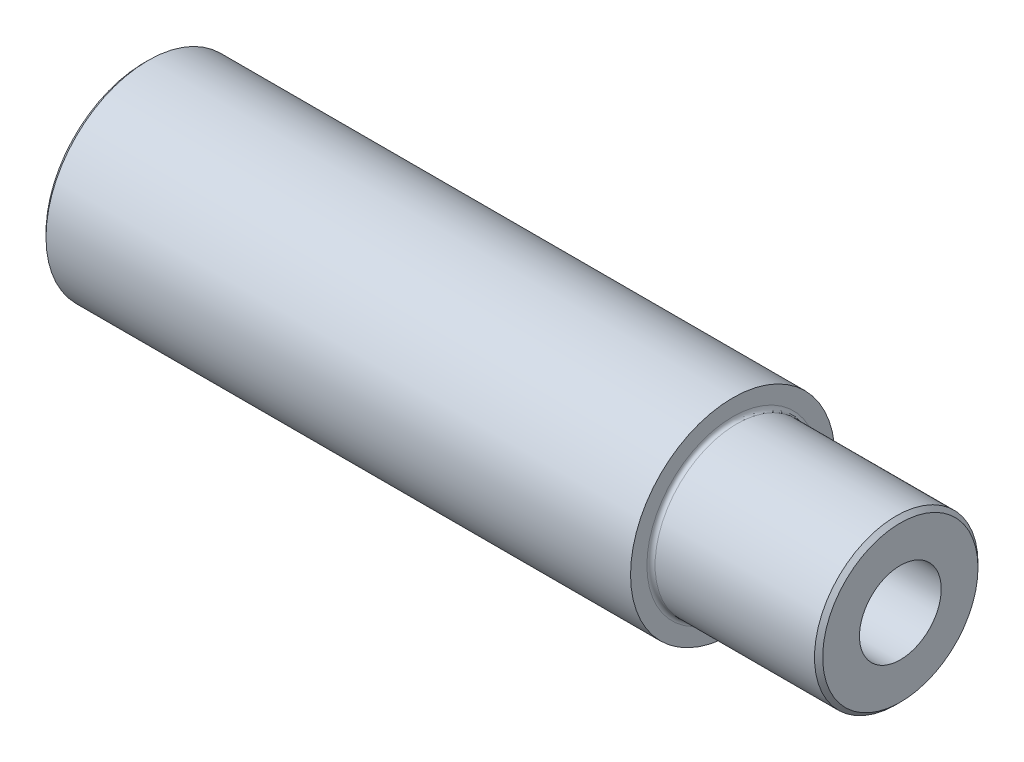
ISO-10303-21;
HEADER;
FILE_DESCRIPTION(('STEP AP214'),'2;1');
FILE_NAME('part.step','',(''),(''),'','','');
FILE_SCHEMA(('AUTOMOTIVE_DESIGN { 1 0 10303 214 1 1 1 1 }'));
ENDSEC;
DATA;
#1=APPLICATION_CONTEXT('core data for automotive mechanical design processes');
#2=APPLICATION_PROTOCOL_DEFINITION('international standard','automotive_design',2000,#1);
#3=PRODUCT_CONTEXT('',#1,'mechanical');
#4=PRODUCT('Part','Part','',(#3));
#5=PRODUCT_RELATED_PRODUCT_CATEGORY('part','',(#4));
#6=PRODUCT_DEFINITION_FORMATION('','',#4);
#7=PRODUCT_DEFINITION_CONTEXT('part definition',#1,'design');
#8=PRODUCT_DEFINITION('design','',#6,#7);
#9=PRODUCT_DEFINITION_SHAPE('','',#8);
#10=(LENGTH_UNIT() NAMED_UNIT(*) SI_UNIT(.MILLI.,.METRE.));
#11=(NAMED_UNIT(*) PLANE_ANGLE_UNIT() SI_UNIT($,.RADIAN.));
#12=(NAMED_UNIT(*) SI_UNIT($,.STERADIAN.) SOLID_ANGLE_UNIT());
#13=UNCERTAINTY_MEASURE_WITH_UNIT(LENGTH_MEASURE(1.E-05),#10,'distance_accuracy_value','');
#14=(GEOMETRIC_REPRESENTATION_CONTEXT(3) GLOBAL_UNCERTAINTY_ASSIGNED_CONTEXT((#13)) GLOBAL_UNIT_ASSIGNED_CONTEXT((#10,
#11,#12)) REPRESENTATION_CONTEXT('',''));
#15=CARTESIAN_POINT('',(0.,0.,0.));
#16=DIRECTION('',(0.,0.,1.));
#17=DIRECTION('',(1.,0.,0.));
#18=AXIS2_PLACEMENT_3D('',#15,#16,#17);
#19=CARTESIAN_POINT('',(92.5,0.,0.));
#20=DIRECTION('',(1.,0.,0.));
#21=DIRECTION('',(0.,0.,-1.));
#22=AXIS2_PLACEMENT_3D('',#19,#20,#21);
#23=PLANE('',#22);
#24=CARTESIAN_POINT('',(92.5,0.,0.));
#25=DIRECTION('',(1.,0.,0.));
#26=DIRECTION('',(0.,0.,-1.));
#27=AXIS2_PLACEMENT_3D('',#24,#25,#26);
#28=CIRCLE('',#27,9.49999999999999);
#29=CARTESIAN_POINT('',(92.5,0.,-9.49999999999999));
#30=VERTEX_POINT('',#29);
#31=EDGE_CURVE('E56',#30,#30,#28,.T.);
#32=ORIENTED_EDGE('',*,*,#31,.T.);
#33=EDGE_LOOP('',(#32));
#34=FACE_BOUND('',#33,.T.);
#35=CARTESIAN_POINT('',(92.5,0.,0.));
#36=DIRECTION('',(1.,0.,0.));
#37=DIRECTION('',(0.,0.,-1.));
#38=AXIS2_PLACEMENT_3D('',#35,#36,#37);
#39=CIRCLE('',#38,5.);
#40=CARTESIAN_POINT('',(92.5,0.,-5.));
#41=VERTEX_POINT('',#40);
#42=EDGE_CURVE('E79',#41,#41,#39,.T.);
#43=ORIENTED_EDGE('',*,*,#42,.F.);
#44=EDGE_LOOP('',(#43));
#45=FACE_BOUND('',#44,.T.);
#46=ADVANCED_FACE('F49',(#34,#45),#23,.T.);
#47=CARTESIAN_POINT('',(92.5,0.,0.));
#48=DIRECTION('',(-1.,0.,0.));
#49=DIRECTION('',(0.,0.,1.));
#50=AXIS2_PLACEMENT_3D('',#47,#48,#49);
#51=CYLINDRICAL_SURFACE('',#50,12.5);
#52=CARTESIAN_POINT('',(0.500000000000014,0.,0.));
#53=DIRECTION('',(1.,0.,0.));
#54=DIRECTION('',(0.,0.,-1.));
#55=AXIS2_PLACEMENT_3D('',#52,#53,#54);
#56=CIRCLE('',#55,12.5);
#57=CARTESIAN_POINT('',(0.500000000000014,0.,-12.5));
#58=VERTEX_POINT('',#57);
#59=EDGE_CURVE('E65',#58,#58,#56,.T.);
#60=ORIENTED_EDGE('',*,*,#59,.T.);
#61=EDGE_LOOP('',(#60));
#62=FACE_BOUND('',#61,.T.);
#63=CARTESIAN_POINT('',(72.,0.,0.));
#64=DIRECTION('',(1.,0.,0.));
#65=DIRECTION('',(0.,0.,-1.));
#66=AXIS2_PLACEMENT_3D('',#63,#64,#65);
#67=CIRCLE('',#66,12.5);
#68=CARTESIAN_POINT('',(72.,0.,-12.5));
#69=VERTEX_POINT('',#68);
#70=EDGE_CURVE('E80',#69,#69,#67,.T.);
#71=ORIENTED_EDGE('',*,*,#70,.F.);
#72=EDGE_LOOP('',(#71));
#73=FACE_BOUND('',#72,.T.);
#74=ADVANCED_FACE('F95',(#62,#73),#51,.T.);
#75=CARTESIAN_POINT('',(0.,0.,0.));
#76=DIRECTION('',(1.,0.,0.));
#77=DIRECTION('',(0.,0.,-1.));
#78=AXIS2_PLACEMENT_3D('',#75,#76,#77);
#79=PLANE('',#78);
#80=CARTESIAN_POINT('',(0.,0.,0.));
#81=DIRECTION('',(1.,0.,0.));
#82=DIRECTION('',(0.,0.,-1.));
#83=AXIS2_PLACEMENT_3D('',#80,#81,#82);
#84=CIRCLE('',#83,12.);
#85=CARTESIAN_POINT('',(0.,0.,-12.));
#86=VERTEX_POINT('',#85);
#87=EDGE_CURVE('E60',#86,#86,#84,.F.);
#88=ORIENTED_EDGE('',*,*,#87,.T.);
#89=EDGE_LOOP('',(#88));
#90=FACE_BOUND('',#89,.T.);
#91=CARTESIAN_POINT('',(0.,0.,0.));
#92=DIRECTION('',(1.,0.,0.));
#93=DIRECTION('',(0.,0.,-1.));
#94=AXIS2_PLACEMENT_3D('',#91,#92,#93);
#95=CIRCLE('',#94,5.);
#96=CARTESIAN_POINT('',(0.,0.,-5.));
#97=VERTEX_POINT('',#96);
#98=EDGE_CURVE('E84',#97,#97,#95,.T.);
#99=ORIENTED_EDGE('',*,*,#98,.T.);
#100=EDGE_LOOP('',(#99));
#101=FACE_BOUND('',#100,.T.);
#102=ADVANCED_FACE('F100',(#90,#101),#79,.F.);
#103=CARTESIAN_POINT('',(92.5,0.,0.));
#104=DIRECTION('',(-1.,0.,0.));
#105=DIRECTION('',(0.,0.,1.));
#106=AXIS2_PLACEMENT_3D('',#103,#104,#105);
#107=CYLINDRICAL_SURFACE('',#106,5.);
#108=ORIENTED_EDGE('',*,*,#42,.T.);
#109=EDGE_LOOP('',(#108));
#110=FACE_BOUND('',#109,.T.);
#111=ORIENTED_EDGE('',*,*,#98,.F.);
#112=EDGE_LOOP('',(#111));
#113=FACE_BOUND('',#112,.T.);
#114=ADVANCED_FACE('F91',(#110,#113),#107,.F.);
#115=CARTESIAN_POINT('',(72.,0.,0.));
#116=DIRECTION('',(1.,0.,0.));
#117=DIRECTION('',(0.,0.,-1.));
#118=AXIS2_PLACEMENT_3D('',#115,#116,#117);
#119=PLANE('',#118);
#120=CARTESIAN_POINT('',(72.,0.,0.));
#121=DIRECTION('',(1.,0.,0.));
#122=DIRECTION('',(0.,0.,-1.));
#123=AXIS2_PLACEMENT_3D('',#120,#121,#122);
#124=CIRCLE('',#123,10.5);
#125=CARTESIAN_POINT('',(72.,0.,-10.5));
#126=VERTEX_POINT('',#125);
#127=EDGE_CURVE('E71',#126,#126,#124,.F.);
#128=ORIENTED_EDGE('',*,*,#127,.T.);
#129=EDGE_LOOP('',(#128));
#130=FACE_BOUND('',#129,.T.);
#131=ORIENTED_EDGE('',*,*,#70,.T.);
#132=EDGE_LOOP('',(#131));
#133=FACE_BOUND('',#132,.T.);
#134=ADVANCED_FACE('F126',(#130,#133),#119,.T.);
#135=CARTESIAN_POINT('',(72.,0.,0.));
#136=DIRECTION('',(1.,0.,0.));
#137=DIRECTION('',(0.,0.,-1.));
#138=AXIS2_PLACEMENT_3D('',#135,#136,#137);
#139=CYLINDRICAL_SURFACE('',#138,10.);
#140=CARTESIAN_POINT('',(92.,0.,0.));
#141=DIRECTION('',(1.,0.,0.));
#142=DIRECTION('',(0.,0.,-1.));
#143=AXIS2_PLACEMENT_3D('',#140,#141,#142);
#144=CIRCLE('',#143,10.);
#145=CARTESIAN_POINT('',(92.,0.,-10.));
#146=VERTEX_POINT('',#145);
#147=EDGE_CURVE('E13',#146,#146,#144,.F.);
#148=ORIENTED_EDGE('',*,*,#147,.T.);
#149=EDGE_LOOP('',(#148));
#150=FACE_BOUND('',#149,.T.);
#151=CARTESIAN_POINT('',(72.5,0.,0.));
#152=DIRECTION('',(1.,0.,0.));
#153=DIRECTION('',(0.,0.,-1.));
#154=AXIS2_PLACEMENT_3D('',#151,#152,#153);
#155=CIRCLE('',#154,10.);
#156=CARTESIAN_POINT('',(72.5,0.,-10.));
#157=VERTEX_POINT('',#156);
#158=EDGE_CURVE('E75',#157,#157,#155,.T.);
#159=ORIENTED_EDGE('',*,*,#158,.T.);
#160=EDGE_LOOP('',(#159));
#161=FACE_BOUND('',#160,.T.);
#162=ADVANCED_FACE('F112',(#150,#161),#139,.T.);
#163=CARTESIAN_POINT('',(72.5,0.,0.));
#164=DIRECTION('',(1.,0.,0.));
#165=DIRECTION('',(0.,0.,-1.));
#166=AXIS2_PLACEMENT_3D('',#163,#164,#165);
#167=TOROIDAL_SURFACE('',#166,10.5,0.5);
#168=ORIENTED_EDGE('',*,*,#127,.F.);
#169=EDGE_LOOP('',(#168));
#170=FACE_BOUND('',#169,.T.);
#171=ORIENTED_EDGE('',*,*,#158,.F.);
#172=EDGE_LOOP('',(#171));
#173=FACE_BOUND('',#172,.T.);
#174=ADVANCED_FACE('F109',(#170,#173),#167,.F.);
#175=CARTESIAN_POINT('',(0.500000000000014,0.,0.));
#176=DIRECTION('',(1.,0.,0.));
#177=DIRECTION('',(0.,0.,-1.));
#178=AXIS2_PLACEMENT_3D('',#175,#176,#177);
#179=CONICAL_SURFACE('',#178,12.5,0.785398163397459);
#180=ORIENTED_EDGE('',*,*,#87,.F.);
#181=EDGE_LOOP('',(#180));
#182=FACE_BOUND('',#181,.T.);
#183=ORIENTED_EDGE('',*,*,#59,.F.);
#184=EDGE_LOOP('',(#183));
#185=FACE_BOUND('',#184,.T.);
#186=ADVANCED_FACE('F111',(#182,#185),#179,.T.);
#187=CARTESIAN_POINT('',(92.5,0.,0.));
#188=DIRECTION('',(-1.,0.,0.));
#189=DIRECTION('',(0.,0.,1.));
#190=AXIS2_PLACEMENT_3D('',#187,#188,#189);
#191=CONICAL_SURFACE('',#190,9.49999999999999,0.785398163397454);
#192=ORIENTED_EDGE('',*,*,#147,.F.);
#193=EDGE_LOOP('',(#192));
#194=FACE_BOUND('',#193,.T.);
#195=ORIENTED_EDGE('',*,*,#31,.F.);
#196=EDGE_LOOP('',(#195));
#197=FACE_BOUND('',#196,.T.);
#198=ADVANCED_FACE('F51',(#194,#197),#191,.T.);
#199=CLOSED_SHELL('',(#46,#74,#102,#114,#134,#162,#174,#186,#198));
#200=MANIFOLD_SOLID_BREP('B2',#199);
#201=ADVANCED_BREP_SHAPE_REPRESENTATION('',(#18,#200),#14);
#202=SHAPE_DEFINITION_REPRESENTATION(#9,#201);
ENDSEC;
END-ISO-10303-21;
